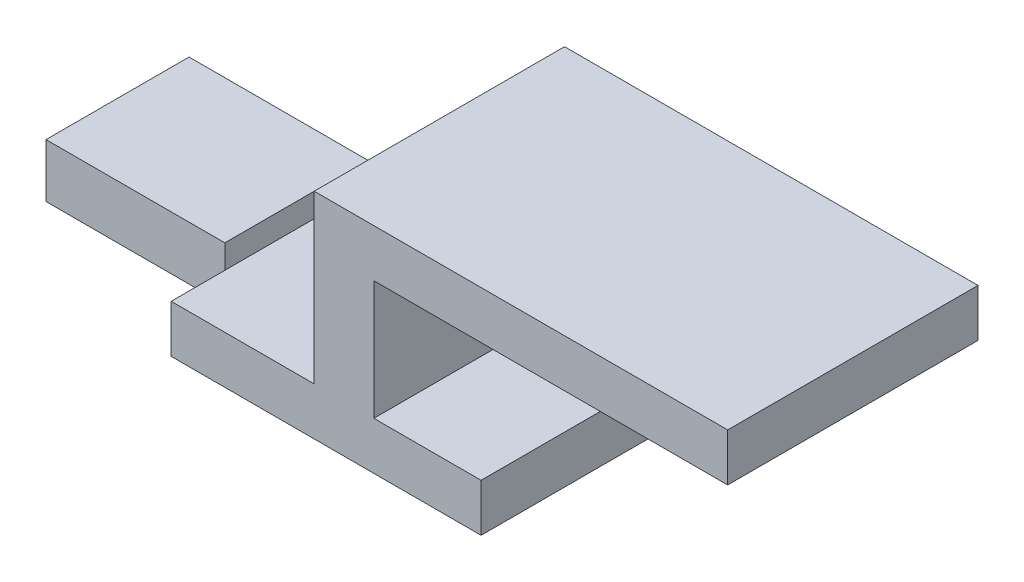
ISO-10303-21;
HEADER;
FILE_DESCRIPTION(('STEP AP214'),'2;1');
FILE_NAME('part.step','',(''),(''),'','','');
FILE_SCHEMA(('AUTOMOTIVE_DESIGN { 1 0 10303 214 1 1 1 1 }'));
ENDSEC;
DATA;
#1=APPLICATION_CONTEXT('core data for automotive mechanical design processes');
#2=APPLICATION_PROTOCOL_DEFINITION('international standard','automotive_design',2000,#1);
#3=PRODUCT_CONTEXT('',#1,'mechanical');
#4=PRODUCT('Part','Part','',(#3));
#5=PRODUCT_RELATED_PRODUCT_CATEGORY('part','',(#4));
#6=PRODUCT_DEFINITION_FORMATION('','',#4);
#7=PRODUCT_DEFINITION_CONTEXT('part definition',#1,'design');
#8=PRODUCT_DEFINITION('design','',#6,#7);
#9=PRODUCT_DEFINITION_SHAPE('','',#8);
#10=(LENGTH_UNIT() NAMED_UNIT(*) SI_UNIT(.MILLI.,.METRE.));
#11=(NAMED_UNIT(*) PLANE_ANGLE_UNIT() SI_UNIT($,.RADIAN.));
#12=(NAMED_UNIT(*) SI_UNIT($,.STERADIAN.) SOLID_ANGLE_UNIT());
#13=UNCERTAINTY_MEASURE_WITH_UNIT(LENGTH_MEASURE(1.E-05),#10,'distance_accuracy_value','');
#14=(GEOMETRIC_REPRESENTATION_CONTEXT(3) GLOBAL_UNCERTAINTY_ASSIGNED_CONTEXT((#13)) GLOBAL_UNIT_ASSIGNED_CONTEXT((#10,
#11,#12)) REPRESENTATION_CONTEXT('',''));
#15=CARTESIAN_POINT('',(0.,0.,0.));
#16=DIRECTION('',(0.,0.,1.));
#17=DIRECTION('',(1.,0.,0.));
#18=AXIS2_PLACEMENT_3D('',#15,#16,#17);
#19=CARTESIAN_POINT('',(-13.,-2.,21.));
#20=DIRECTION('',(1.,0.,0.));
#21=DIRECTION('',(0.,0.,-1.));
#22=AXIS2_PLACEMENT_3D('',#19,#20,#21);
#23=PLANE('',#22);
#24=DIRECTION('',(0.,-1.,0.));
#25=VECTOR('',#24,1.);
#26=CARTESIAN_POINT('',(-13.,-0.5,4.5));
#27=LINE('',#26,#25);
#28=CARTESIAN_POINT('',(-13.,2.,4.50000000000001));
#29=VERTEX_POINT('',#28);
#30=CARTESIAN_POINT('',(-13.,-0.5,4.5));
#31=VERTEX_POINT('',#30);
#32=EDGE_CURVE('E11',#29,#31,#27,.T.);
#33=ORIENTED_EDGE('',*,*,#32,.F.);
#34=DIRECTION('',(0.,0.,-1.));
#35=VECTOR('',#34,1.);
#36=CARTESIAN_POINT('',(-13.,2.,21.));
#37=LINE('',#36,#35);
#38=CARTESIAN_POINT('',(-13.,2.,0.));
#39=VERTEX_POINT('',#38);
#40=EDGE_CURVE('E218',#29,#39,#37,.T.);
#41=ORIENTED_EDGE('',*,*,#40,.T.);
#42=DIRECTION('',(0.,-1.,0.));
#43=VECTOR('',#42,1.);
#44=CARTESIAN_POINT('',(-13.,-2.,0.));
#45=LINE('',#44,#43);
#46=CARTESIAN_POINT('',(-13.,-2.,0.));
#47=VERTEX_POINT('',#46);
#48=EDGE_CURVE('E205',#39,#47,#45,.T.);
#49=ORIENTED_EDGE('',*,*,#48,.T.);
#50=DIRECTION('',(0.,0.,-1.));
#51=VECTOR('',#50,1.);
#52=CARTESIAN_POINT('',(-13.,-2.,21.));
#53=LINE('',#52,#51);
#54=CARTESIAN_POINT('',(-13.,-2.,21.));
#55=VERTEX_POINT('',#54);
#56=EDGE_CURVE('E215',#55,#47,#53,.T.);
#57=ORIENTED_EDGE('',*,*,#56,.F.);
#58=DIRECTION('',(0.,-1.,0.));
#59=VECTOR('',#58,1.);
#60=CARTESIAN_POINT('',(-13.,-2.,21.));
#61=LINE('',#60,#59);
#62=CARTESIAN_POINT('',(-13.,2.,21.));
#63=VERTEX_POINT('',#62);
#64=EDGE_CURVE('E186',#63,#55,#61,.T.);
#65=ORIENTED_EDGE('',*,*,#64,.F.);
#66=CARTESIAN_POINT('',(-13.,2.,16.5));
#67=VERTEX_POINT('',#66);
#68=EDGE_CURVE('E219',#63,#67,#37,.T.);
#69=ORIENTED_EDGE('',*,*,#68,.T.);
#70=DIRECTION('',(0.,1.,0.));
#71=VECTOR('',#70,1.);
#72=CARTESIAN_POINT('',(-13.,-0.5,16.5));
#73=LINE('',#72,#71);
#74=CARTESIAN_POINT('',(-13.,-0.5,16.5));
#75=VERTEX_POINT('',#74);
#76=EDGE_CURVE('E442',#75,#67,#73,.T.);
#77=ORIENTED_EDGE('',*,*,#76,.F.);
#78=DIRECTION('',(0.,0.,1.));
#79=VECTOR('',#78,1.);
#80=CARTESIAN_POINT('',(-13.,-0.5,4.5));
#81=LINE('',#80,#79);
#82=EDGE_CURVE('E50',#31,#75,#81,.T.);
#83=ORIENTED_EDGE('',*,*,#82,.F.);
#84=EDGE_LOOP('',(#33,#41,#49,#57,#65,#69,#77,#83));
#85=FACE_BOUND('',#84,.T.);
#86=ADVANCED_FACE('F33',(#85),#23,.F.);
#87=CARTESIAN_POINT('',(3.99999999999999,2.,21.));
#88=DIRECTION('',(0.,-1.,0.));
#89=DIRECTION('',(0.,0.,-1.));
#90=AXIS2_PLACEMENT_3D('',#87,#88,#89);
#91=PLANE('',#90);
#92=DIRECTION('',(-1.,0.,0.));
#93=VECTOR('',#92,1.);
#94=CARTESIAN_POINT('',(3.99999999999999,2.,0.));
#95=LINE('',#94,#93);
#96=CARTESIAN_POINT('',(13.,2.,0.));
#97=VERTEX_POINT('',#96);
#98=CARTESIAN_POINT('',(3.99999999999999,2.,0.));
#99=VERTEX_POINT('',#98);
#100=EDGE_CURVE('E161',#97,#99,#95,.T.);
#101=ORIENTED_EDGE('',*,*,#100,.T.);
#102=DIRECTION('',(0.,0.,-1.));
#103=VECTOR('',#102,1.);
#104=CARTESIAN_POINT('',(3.99999999999999,2.,21.));
#105=LINE('',#104,#103);
#106=CARTESIAN_POINT('',(3.99999999999999,2.,21.));
#107=VERTEX_POINT('',#106);
#108=EDGE_CURVE('E37',#107,#99,#105,.T.);
#109=ORIENTED_EDGE('',*,*,#108,.F.);
#110=DIRECTION('',(-1.,0.,0.));
#111=VECTOR('',#110,1.);
#112=CARTESIAN_POINT('',(3.99999999999999,2.,21.));
#113=LINE('',#112,#111);
#114=CARTESIAN_POINT('',(13.,2.,21.));
#115=VERTEX_POINT('',#114);
#116=EDGE_CURVE('E170',#115,#107,#113,.T.);
#117=ORIENTED_EDGE('',*,*,#116,.F.);
#118=DIRECTION('',(0.,0.,-1.));
#119=VECTOR('',#118,1.);
#120=CARTESIAN_POINT('',(13.,2.,21.));
#121=LINE('',#120,#119);
#122=EDGE_CURVE('E191',#115,#97,#121,.T.);
#123=ORIENTED_EDGE('',*,*,#122,.T.);
#124=EDGE_LOOP('',(#101,#109,#117,#123));
#125=FACE_BOUND('',#124,.T.);
#126=ADVANCED_FACE('F35',(#125),#91,.F.);
#127=CARTESIAN_POINT('',(3.99999999999999,2.,21.));
#128=DIRECTION('',(-1.,0.,0.));
#129=DIRECTION('',(0.,-1.,0.));
#130=AXIS2_PLACEMENT_3D('',#127,#128,#129);
#131=PLANE('',#130);
#132=DIRECTION('',(0.,1.,0.));
#133=VECTOR('',#132,1.);
#134=CARTESIAN_POINT('',(3.99999999999999,2.,0.));
#135=LINE('',#134,#133);
#136=CARTESIAN_POINT('',(3.99999999999999,12.,0.));
#137=VERTEX_POINT('',#136);
#138=EDGE_CURVE('E164',#99,#137,#135,.T.);
#139=ORIENTED_EDGE('',*,*,#138,.T.);
#140=DIRECTION('',(0.,0.,-1.));
#141=VECTOR('',#140,1.);
#142=CARTESIAN_POINT('',(3.99999999999999,12.,21.));
#143=LINE('',#142,#141);
#144=CARTESIAN_POINT('',(3.99999999999999,12.,21.));
#145=VERTEX_POINT('',#144);
#146=EDGE_CURVE('E234',#145,#137,#143,.T.);
#147=ORIENTED_EDGE('',*,*,#146,.F.);
#148=DIRECTION('',(0.,1.,0.));
#149=VECTOR('',#148,1.);
#150=CARTESIAN_POINT('',(3.99999999999999,2.,21.));
#151=LINE('',#150,#149);
#152=EDGE_CURVE('E173',#107,#145,#151,.T.);
#153=ORIENTED_EDGE('',*,*,#152,.F.);
#154=ORIENTED_EDGE('',*,*,#108,.T.);
#155=EDGE_LOOP('',(#139,#147,#153,#154));
#156=FACE_BOUND('',#155,.T.);
#157=ADVANCED_FACE('F243',(#156),#131,.F.);
#158=CARTESIAN_POINT('',(3.99999999999999,12.,21.));
#159=DIRECTION('',(0.,1.,0.));
#160=DIRECTION('',(0.,0.,1.));
#161=AXIS2_PLACEMENT_3D('',#158,#159,#160);
#162=PLANE('',#161);
#163=DIRECTION('',(1.,0.,0.));
#164=VECTOR('',#163,1.);
#165=CARTESIAN_POINT('',(3.99999999999999,12.,0.));
#166=LINE('',#165,#164);
#167=CARTESIAN_POINT('',(33.6847290640394,12.,0.));
#168=VERTEX_POINT('',#167);
#169=EDGE_CURVE('E194',#137,#168,#166,.T.);
#170=ORIENTED_EDGE('',*,*,#169,.T.);
#171=DIRECTION('',(0.,0.,-1.));
#172=VECTOR('',#171,1.);
#173=CARTESIAN_POINT('',(33.6847290640394,12.,21.));
#174=LINE('',#173,#172);
#175=CARTESIAN_POINT('',(33.6847290640394,12.,21.));
#176=VERTEX_POINT('',#175);
#177=EDGE_CURVE('E232',#176,#168,#174,.T.);
#178=ORIENTED_EDGE('',*,*,#177,.F.);
#179=DIRECTION('',(1.,0.,0.));
#180=VECTOR('',#179,1.);
#181=CARTESIAN_POINT('',(3.99999999999999,12.,21.));
#182=LINE('',#181,#180);
#183=EDGE_CURVE('E176',#145,#176,#182,.T.);
#184=ORIENTED_EDGE('',*,*,#183,.F.);
#185=ORIENTED_EDGE('',*,*,#146,.T.);
#186=EDGE_LOOP('',(#170,#178,#184,#185));
#187=FACE_BOUND('',#186,.T.);
#188=ADVANCED_FACE('F255',(#187),#162,.F.);
#189=CARTESIAN_POINT('',(33.6847290640394,12.,21.));
#190=DIRECTION('',(-1.,0.,0.));
#191=DIRECTION('',(0.,0.,1.));
#192=AXIS2_PLACEMENT_3D('',#189,#190,#191);
#193=PLANE('',#192);
#194=DIRECTION('',(0.,1.,0.));
#195=VECTOR('',#194,1.);
#196=CARTESIAN_POINT('',(33.6847290640394,12.,0.));
#197=LINE('',#196,#195);
#198=CARTESIAN_POINT('',(33.6847290640394,16.,0.));
#199=VERTEX_POINT('',#198);
#200=EDGE_CURVE('E196',#168,#199,#197,.T.);
#201=ORIENTED_EDGE('',*,*,#200,.T.);
#202=DIRECTION('',(0.,0.,-1.));
#203=VECTOR('',#202,1.);
#204=CARTESIAN_POINT('',(33.6847290640394,16.,21.));
#205=LINE('',#204,#203);
#206=CARTESIAN_POINT('',(33.6847290640394,16.,21.));
#207=VERTEX_POINT('',#206);
#208=EDGE_CURVE('E229',#207,#199,#205,.T.);
#209=ORIENTED_EDGE('',*,*,#208,.F.);
#210=DIRECTION('',(0.,1.,0.));
#211=VECTOR('',#210,1.);
#212=CARTESIAN_POINT('',(33.6847290640394,12.,21.));
#213=LINE('',#212,#211);
#214=EDGE_CURVE('E178',#176,#207,#213,.T.);
#215=ORIENTED_EDGE('',*,*,#214,.F.);
#216=ORIENTED_EDGE('',*,*,#177,.T.);
#217=EDGE_LOOP('',(#201,#209,#215,#216));
#218=FACE_BOUND('',#217,.T.);
#219=ADVANCED_FACE('F258',(#218),#193,.F.);
#220=CARTESIAN_POINT('',(33.6847290640394,16.,21.));
#221=DIRECTION('',(0.,-1.,0.));
#222=DIRECTION('',(1.,0.,0.));
#223=AXIS2_PLACEMENT_3D('',#220,#221,#222);
#224=PLANE('',#223);
#225=DIRECTION('',(-1.,0.,0.));
#226=VECTOR('',#225,1.);
#227=CARTESIAN_POINT('',(33.6847290640394,16.,0.));
#228=LINE('',#227,#226);
#229=CARTESIAN_POINT('',(-1.00000000000001,16.,0.));
#230=VERTEX_POINT('',#229);
#231=EDGE_CURVE('E198',#199,#230,#228,.T.);
#232=ORIENTED_EDGE('',*,*,#231,.T.);
#233=DIRECTION('',(0.,0.,-1.));
#234=VECTOR('',#233,1.);
#235=CARTESIAN_POINT('',(-1.00000000000001,16.,21.));
#236=LINE('',#235,#234);
#237=CARTESIAN_POINT('',(-1.00000000000001,16.,21.));
#238=VERTEX_POINT('',#237);
#239=EDGE_CURVE('E226',#238,#230,#236,.T.);
#240=ORIENTED_EDGE('',*,*,#239,.F.);
#241=DIRECTION('',(-1.,0.,0.));
#242=VECTOR('',#241,1.);
#243=CARTESIAN_POINT('',(33.6847290640394,16.,21.));
#244=LINE('',#243,#242);
#245=EDGE_CURVE('E180',#207,#238,#244,.T.);
#246=ORIENTED_EDGE('',*,*,#245,.F.);
#247=ORIENTED_EDGE('',*,*,#208,.T.);
#248=EDGE_LOOP('',(#232,#240,#246,#247));
#249=FACE_BOUND('',#248,.T.);
#250=ADVANCED_FACE('F286',(#249),#224,.F.);
#251=CARTESIAN_POINT('',(-1.00000000000001,16.,21.));
#252=DIRECTION('',(1.,0.,0.));
#253=DIRECTION('',(0.,1.,0.));
#254=AXIS2_PLACEMENT_3D('',#251,#252,#253);
#255=PLANE('',#254);
#256=DIRECTION('',(0.,-1.,0.));
#257=VECTOR('',#256,1.);
#258=CARTESIAN_POINT('',(-1.00000000000001,16.,0.));
#259=LINE('',#258,#257);
#260=CARTESIAN_POINT('',(-1.,2.,0.));
#261=VERTEX_POINT('',#260);
#262=EDGE_CURVE('E200',#230,#261,#259,.T.);
#263=ORIENTED_EDGE('',*,*,#262,.T.);
#264=DIRECTION('',(0.,0.,-1.));
#265=VECTOR('',#264,1.);
#266=CARTESIAN_POINT('',(-1.,2.,21.));
#267=LINE('',#266,#265);
#268=CARTESIAN_POINT('',(-1.,2.,21.));
#269=VERTEX_POINT('',#268);
#270=EDGE_CURVE('E222',#269,#261,#267,.T.);
#271=ORIENTED_EDGE('',*,*,#270,.F.);
#272=DIRECTION('',(0.,-1.,0.));
#273=VECTOR('',#272,1.);
#274=CARTESIAN_POINT('',(-1.00000000000001,16.,21.));
#275=LINE('',#274,#273);
#276=EDGE_CURVE('E182',#238,#269,#275,.T.);
#277=ORIENTED_EDGE('',*,*,#276,.F.);
#278=ORIENTED_EDGE('',*,*,#239,.T.);
#279=EDGE_LOOP('',(#263,#271,#277,#278));
#280=FACE_BOUND('',#279,.T.);
#281=ADVANCED_FACE('F284',(#280),#255,.F.);
#282=CARTESIAN_POINT('',(-13.,2.,21.));
#283=DIRECTION('',(0.,-1.,0.));
#284=DIRECTION('',(0.,0.,-1.));
#285=AXIS2_PLACEMENT_3D('',#282,#283,#284);
#286=PLANE('',#285);
#287=DIRECTION('',(-1.,0.,0.));
#288=VECTOR('',#287,1.);
#289=CARTESIAN_POINT('',(-13.,2.,0.));
#290=LINE('',#289,#288);
#291=EDGE_CURVE('E202',#261,#39,#290,.T.);
#292=ORIENTED_EDGE('',*,*,#291,.T.);
#293=ORIENTED_EDGE('',*,*,#40,.F.);
#294=EDGE_CURVE('E223',#67,#29,#37,.T.);
#295=ORIENTED_EDGE('',*,*,#294,.F.);
#296=ORIENTED_EDGE('',*,*,#68,.F.);
#297=DIRECTION('',(-1.,0.,0.));
#298=VECTOR('',#297,1.);
#299=CARTESIAN_POINT('',(-13.,2.,21.));
#300=LINE('',#299,#298);
#301=EDGE_CURVE('E184',#269,#63,#300,.T.);
#302=ORIENTED_EDGE('',*,*,#301,.F.);
#303=ORIENTED_EDGE('',*,*,#270,.T.);
#304=EDGE_LOOP('',(#292,#293,#295,#296,#302,#303));
#305=FACE_BOUND('',#304,.T.);
#306=ADVANCED_FACE('F278',(#305),#286,.F.);
#307=CARTESIAN_POINT('',(-13.,-2.,21.));
#308=DIRECTION('',(0.,1.,0.));
#309=DIRECTION('',(0.,0.,1.));
#310=AXIS2_PLACEMENT_3D('',#307,#308,#309);
#311=PLANE('',#310);
#312=DIRECTION('',(1.,0.,0.));
#313=VECTOR('',#312,1.);
#314=CARTESIAN_POINT('',(-13.,-2.,0.));
#315=LINE('',#314,#313);
#316=CARTESIAN_POINT('',(13.,-2.,0.));
#317=VERTEX_POINT('',#316);
#318=EDGE_CURVE('E207',#47,#317,#315,.T.);
#319=ORIENTED_EDGE('',*,*,#318,.T.);
#320=DIRECTION('',(0.,0.,-1.));
#321=VECTOR('',#320,1.);
#322=CARTESIAN_POINT('',(13.,-2.,21.));
#323=LINE('',#322,#321);
#324=CARTESIAN_POINT('',(13.,-2.,21.));
#325=VERTEX_POINT('',#324);
#326=EDGE_CURVE('E212',#325,#317,#323,.T.);
#327=ORIENTED_EDGE('',*,*,#326,.F.);
#328=DIRECTION('',(1.,0.,0.));
#329=VECTOR('',#328,1.);
#330=CARTESIAN_POINT('',(-13.,-2.,21.));
#331=LINE('',#330,#329);
#332=EDGE_CURVE('E188',#55,#325,#331,.T.);
#333=ORIENTED_EDGE('',*,*,#332,.F.);
#334=ORIENTED_EDGE('',*,*,#56,.T.);
#335=EDGE_LOOP('',(#319,#327,#333,#334));
#336=FACE_BOUND('',#335,.T.);
#337=ADVANCED_FACE('F270',(#336),#311,.F.);
#338=CARTESIAN_POINT('',(13.,-2.,21.));
#339=DIRECTION('',(-1.,0.,0.));
#340=DIRECTION('',(0.,0.,1.));
#341=AXIS2_PLACEMENT_3D('',#338,#339,#340);
#342=PLANE('',#341);
#343=DIRECTION('',(0.,1.,0.));
#344=VECTOR('',#343,1.);
#345=CARTESIAN_POINT('',(13.,-2.,0.));
#346=LINE('',#345,#344);
#347=EDGE_CURVE('E174',#317,#97,#346,.T.);
#348=ORIENTED_EDGE('',*,*,#347,.T.);
#349=ORIENTED_EDGE('',*,*,#122,.F.);
#350=DIRECTION('',(0.,1.,0.));
#351=VECTOR('',#350,1.);
#352=CARTESIAN_POINT('',(13.,-2.,21.));
#353=LINE('',#352,#351);
#354=EDGE_CURVE('E190',#325,#115,#353,.T.);
#355=ORIENTED_EDGE('',*,*,#354,.F.);
#356=ORIENTED_EDGE('',*,*,#326,.T.);
#357=EDGE_LOOP('',(#348,#349,#355,#356));
#358=FACE_BOUND('',#357,.T.);
#359=ADVANCED_FACE('F268',(#358),#342,.F.);
#360=CARTESIAN_POINT('',(0.,0.,21.));
#361=DIRECTION('',(0.,0.,1.));
#362=DIRECTION('',(1.,0.,0.));
#363=AXIS2_PLACEMENT_3D('',#360,#361,#362);
#364=PLANE('',#363);
#365=ORIENTED_EDGE('',*,*,#116,.T.);
#366=ORIENTED_EDGE('',*,*,#152,.T.);
#367=ORIENTED_EDGE('',*,*,#183,.T.);
#368=ORIENTED_EDGE('',*,*,#214,.T.);
#369=ORIENTED_EDGE('',*,*,#245,.T.);
#370=ORIENTED_EDGE('',*,*,#276,.T.);
#371=ORIENTED_EDGE('',*,*,#301,.T.);
#372=ORIENTED_EDGE('',*,*,#64,.T.);
#373=ORIENTED_EDGE('',*,*,#332,.T.);
#374=ORIENTED_EDGE('',*,*,#354,.T.);
#375=EDGE_LOOP('',(#365,#366,#367,#368,#369,#370,#371,#372,#373,#374));
#376=FACE_BOUND('',#375,.T.);
#377=ADVANCED_FACE('F262',(#376),#364,.T.);
#378=CARTESIAN_POINT('',(0.,0.,0.));
#379=DIRECTION('',(0.,0.,1.));
#380=DIRECTION('',(1.,0.,0.));
#381=AXIS2_PLACEMENT_3D('',#378,#379,#380);
#382=PLANE('',#381);
#383=ORIENTED_EDGE('',*,*,#100,.F.);
#384=ORIENTED_EDGE('',*,*,#347,.F.);
#385=ORIENTED_EDGE('',*,*,#318,.F.);
#386=ORIENTED_EDGE('',*,*,#48,.F.);
#387=ORIENTED_EDGE('',*,*,#291,.F.);
#388=ORIENTED_EDGE('',*,*,#262,.F.);
#389=ORIENTED_EDGE('',*,*,#231,.F.);
#390=ORIENTED_EDGE('',*,*,#200,.F.);
#391=ORIENTED_EDGE('',*,*,#169,.F.);
#392=ORIENTED_EDGE('',*,*,#138,.F.);
#393=EDGE_LOOP('',(#383,#384,#385,#386,#387,#388,#389,#390,#391,#392));
#394=FACE_BOUND('',#393,.T.);
#395=ADVANCED_FACE('F250',(#394),#382,.F.);
#396=CARTESIAN_POINT('',(-28.,-0.5,4.5));
#397=DIRECTION('',(0.,0.,1.));
#398=DIRECTION('',(1.,0.,0.));
#399=AXIS2_PLACEMENT_3D('',#396,#397,#398);
#400=PLANE('',#399);
#401=CARTESIAN_POINT('',(-13.,4.,4.5));
#402=VERTEX_POINT('',#401);
#403=EDGE_CURVE('E43',#402,#29,#27,.T.);
#404=ORIENTED_EDGE('',*,*,#403,.T.);
#405=ORIENTED_EDGE('',*,*,#32,.T.);
#406=DIRECTION('',(1.,0.,0.));
#407=VECTOR('',#406,1.);
#408=CARTESIAN_POINT('',(-28.,-0.5,4.5));
#409=LINE('',#408,#407);
#410=CARTESIAN_POINT('',(-28.,-0.5,4.5));
#411=VERTEX_POINT('',#410);
#412=EDGE_CURVE('E142',#411,#31,#409,.T.);
#413=ORIENTED_EDGE('',*,*,#412,.F.);
#414=DIRECTION('',(0.,-1.,0.));
#415=VECTOR('',#414,1.);
#416=CARTESIAN_POINT('',(-28.,-0.5,4.5));
#417=LINE('',#416,#415);
#418=CARTESIAN_POINT('',(-28.,4.,4.5));
#419=VERTEX_POINT('',#418);
#420=EDGE_CURVE('E148',#419,#411,#417,.T.);
#421=ORIENTED_EDGE('',*,*,#420,.F.);
#422=DIRECTION('',(1.,0.,0.));
#423=VECTOR('',#422,1.);
#424=CARTESIAN_POINT('',(-28.,4.,4.5));
#425=LINE('',#424,#423);
#426=EDGE_CURVE('E447',#419,#402,#425,.T.);
#427=ORIENTED_EDGE('',*,*,#426,.T.);
#428=EDGE_LOOP('',(#404,#405,#413,#421,#427));
#429=FACE_BOUND('',#428,.T.);
#430=ADVANCED_FACE('F160',(#429),#400,.F.);
#431=CARTESIAN_POINT('',(-28.,-0.5,4.5));
#432=DIRECTION('',(0.,1.,0.));
#433=DIRECTION('',(0.,0.,1.));
#434=AXIS2_PLACEMENT_3D('',#431,#432,#433);
#435=PLANE('',#434);
#436=ORIENTED_EDGE('',*,*,#82,.T.);
#437=DIRECTION('',(1.,0.,0.));
#438=VECTOR('',#437,1.);
#439=CARTESIAN_POINT('',(-28.,-0.5,16.5));
#440=LINE('',#439,#438);
#441=CARTESIAN_POINT('',(-28.,-0.5,16.5));
#442=VERTEX_POINT('',#441);
#443=EDGE_CURVE('E144',#442,#75,#440,.T.);
#444=ORIENTED_EDGE('',*,*,#443,.F.);
#445=DIRECTION('',(0.,0.,1.));
#446=VECTOR('',#445,1.);
#447=CARTESIAN_POINT('',(-28.,-0.5,4.5));
#448=LINE('',#447,#446);
#449=EDGE_CURVE('E138',#411,#442,#448,.T.);
#450=ORIENTED_EDGE('',*,*,#449,.F.);
#451=ORIENTED_EDGE('',*,*,#412,.T.);
#452=EDGE_LOOP('',(#436,#444,#450,#451));
#453=FACE_BOUND('',#452,.T.);
#454=ADVANCED_FACE('F140',(#453),#435,.F.);
#455=CARTESIAN_POINT('',(-28.,-0.5,16.5));
#456=DIRECTION('',(0.,0.,-1.));
#457=DIRECTION('',(-1.,0.,0.));
#458=AXIS2_PLACEMENT_3D('',#455,#456,#457);
#459=PLANE('',#458);
#460=ORIENTED_EDGE('',*,*,#76,.T.);
#461=CARTESIAN_POINT('',(-13.,4.,16.5));
#462=VERTEX_POINT('',#461);
#463=EDGE_CURVE('E437',#67,#462,#73,.T.);
#464=ORIENTED_EDGE('',*,*,#463,.T.);
#465=DIRECTION('',(1.,0.,0.));
#466=VECTOR('',#465,1.);
#467=CARTESIAN_POINT('',(-28.,4.,16.5));
#468=LINE('',#467,#466);
#469=CARTESIAN_POINT('',(-28.,4.,16.5));
#470=VERTEX_POINT('',#469);
#471=EDGE_CURVE('E166',#470,#462,#468,.T.);
#472=ORIENTED_EDGE('',*,*,#471,.F.);
#473=DIRECTION('',(0.,1.,0.));
#474=VECTOR('',#473,1.);
#475=CARTESIAN_POINT('',(-28.,-0.5,16.5));
#476=LINE('',#475,#474);
#477=EDGE_CURVE('E147',#442,#470,#476,.T.);
#478=ORIENTED_EDGE('',*,*,#477,.F.);
#479=ORIENTED_EDGE('',*,*,#443,.T.);
#480=EDGE_LOOP('',(#460,#464,#472,#478,#479));
#481=FACE_BOUND('',#480,.T.);
#482=ADVANCED_FACE('F321',(#481),#459,.F.);
#483=CARTESIAN_POINT('',(-28.,4.,4.5));
#484=DIRECTION('',(0.,-1.,0.));
#485=DIRECTION('',(0.,0.,-1.));
#486=AXIS2_PLACEMENT_3D('',#483,#484,#485);
#487=PLANE('',#486);
#488=DIRECTION('',(0.,0.,-1.));
#489=VECTOR('',#488,1.);
#490=CARTESIAN_POINT('',(-13.,4.,4.5));
#491=LINE('',#490,#489);
#492=EDGE_CURVE('E157',#462,#402,#491,.T.);
#493=ORIENTED_EDGE('',*,*,#492,.T.);
#494=ORIENTED_EDGE('',*,*,#426,.F.);
#495=DIRECTION('',(0.,0.,-1.));
#496=VECTOR('',#495,1.);
#497=CARTESIAN_POINT('',(-28.,4.,4.5));
#498=LINE('',#497,#496);
#499=EDGE_CURVE('E153',#470,#419,#498,.T.);
#500=ORIENTED_EDGE('',*,*,#499,.F.);
#501=ORIENTED_EDGE('',*,*,#471,.T.);
#502=EDGE_LOOP('',(#493,#494,#500,#501));
#503=FACE_BOUND('',#502,.T.);
#504=ADVANCED_FACE('F324',(#503),#487,.F.);
#505=CARTESIAN_POINT('',(-28.,0.,0.));
#506=DIRECTION('',(1.,0.,0.));
#507=DIRECTION('',(0.,0.,-1.));
#508=AXIS2_PLACEMENT_3D('',#505,#506,#507);
#509=PLANE('',#508);
#510=ORIENTED_EDGE('',*,*,#420,.T.);
#511=ORIENTED_EDGE('',*,*,#449,.T.);
#512=ORIENTED_EDGE('',*,*,#477,.T.);
#513=ORIENTED_EDGE('',*,*,#499,.T.);
#514=EDGE_LOOP('',(#510,#511,#512,#513));
#515=FACE_BOUND('',#514,.T.);
#516=ADVANCED_FACE('F151',(#515),#509,.F.);
#517=CARTESIAN_POINT('',(-13.,0.,0.));
#518=DIRECTION('',(1.,0.,0.));
#519=DIRECTION('',(0.,0.,-1.));
#520=AXIS2_PLACEMENT_3D('',#517,#518,#519);
#521=PLANE('',#520);
#522=ORIENTED_EDGE('',*,*,#463,.F.);
#523=ORIENTED_EDGE('',*,*,#294,.T.);
#524=ORIENTED_EDGE('',*,*,#403,.F.);
#525=ORIENTED_EDGE('',*,*,#492,.F.);
#526=EDGE_LOOP('',(#522,#523,#524,#525));
#527=FACE_BOUND('',#526,.T.);
#528=ADVANCED_FACE('F329',(#527),#521,.T.);
#529=CLOSED_SHELL('',(#86,#126,#157,#188,#219,#250,#281,#306,#337,#359,#377,#395,#430,#454,#482,
#504,#516,#528));
#530=MANIFOLD_SOLID_BREP('B2',#529);
#531=ADVANCED_BREP_SHAPE_REPRESENTATION('',(#18,#530),#14);
#532=SHAPE_DEFINITION_REPRESENTATION(#9,#531);
ENDSEC;
END-ISO-10303-21;
